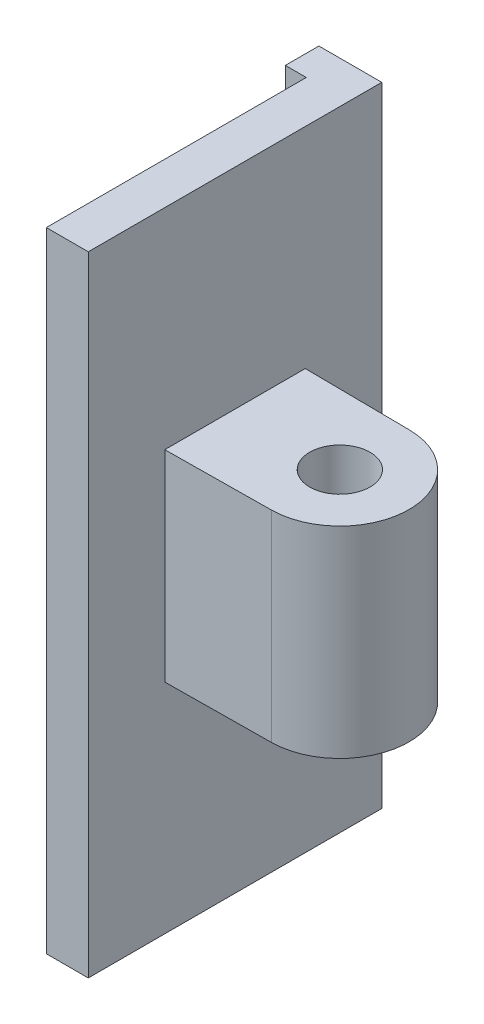
ISO-10303-21;
HEADER;
FILE_DESCRIPTION(('STEP AP214'),'2;1');
FILE_NAME('part.step','',(''),(''),'','','');
FILE_SCHEMA(('AUTOMOTIVE_DESIGN { 1 0 10303 214 1 1 1 1 }'));
ENDSEC;
DATA;
#1=APPLICATION_CONTEXT('core data for automotive mechanical design processes');
#2=APPLICATION_PROTOCOL_DEFINITION('international standard','automotive_design',2000,#1);
#3=PRODUCT_CONTEXT('',#1,'mechanical');
#4=PRODUCT('Part','Part','',(#3));
#5=PRODUCT_RELATED_PRODUCT_CATEGORY('part','',(#4));
#6=PRODUCT_DEFINITION_FORMATION('','',#4);
#7=PRODUCT_DEFINITION_CONTEXT('part definition',#1,'design');
#8=PRODUCT_DEFINITION('design','',#6,#7);
#9=PRODUCT_DEFINITION_SHAPE('','',#8);
#10=(LENGTH_UNIT() NAMED_UNIT(*) SI_UNIT(.MILLI.,.METRE.));
#11=(NAMED_UNIT(*) PLANE_ANGLE_UNIT() SI_UNIT($,.RADIAN.));
#12=(NAMED_UNIT(*) SI_UNIT($,.STERADIAN.) SOLID_ANGLE_UNIT());
#13=UNCERTAINTY_MEASURE_WITH_UNIT(LENGTH_MEASURE(1.E-05),#10,'distance_accuracy_value','');
#14=(GEOMETRIC_REPRESENTATION_CONTEXT(3) GLOBAL_UNCERTAINTY_ASSIGNED_CONTEXT((#13)) GLOBAL_UNIT_ASSIGNED_CONTEXT((#10,
#11,#12)) REPRESENTATION_CONTEXT('',''));
#15=CARTESIAN_POINT('',(0.,0.,0.));
#16=DIRECTION('',(0.,0.,1.));
#17=DIRECTION('',(1.,0.,0.));
#18=AXIS2_PLACEMENT_3D('',#15,#16,#17);
#19=CARTESIAN_POINT('',(0.750000000000001,-7.85,1.75));
#20=DIRECTION('',(1.,0.,0.));
#21=DIRECTION('',(0.,0.,-1.));
#22=AXIS2_PLACEMENT_3D('',#19,#20,#21);
#23=PLANE('',#22);
#24=DIRECTION('',(0.,1.,0.));
#25=VECTOR('',#24,1.);
#26=CARTESIAN_POINT('',(0.750000000000001,-5.35,-1.35));
#27=LINE('',#26,#25);
#28=CARTESIAN_POINT('',(0.750000000000001,-12.85,-1.35));
#29=VERTEX_POINT('',#28);
#30=CARTESIAN_POINT('',(0.750000000000001,-5.35,-1.35));
#31=VERTEX_POINT('',#30);
#32=EDGE_CURVE('E54',#29,#31,#27,.T.);
#33=ORIENTED_EDGE('',*,*,#32,.F.);
#34=DIRECTION('',(0.,0.,1.));
#35=VECTOR('',#34,1.);
#36=CARTESIAN_POINT('',(0.750000000000001,-12.85,-1.75));
#37=LINE('',#36,#35);
#38=CARTESIAN_POINT('',(0.750000000000001,-12.85,1.75));
#39=VERTEX_POINT('',#38);
#40=EDGE_CURVE('E165',#29,#39,#37,.T.);
#41=ORIENTED_EDGE('',*,*,#40,.T.);
#42=DIRECTION('',(0.,-1.,0.));
#43=VECTOR('',#42,1.);
#44=CARTESIAN_POINT('',(0.750000000000001,-7.85,1.75));
#45=LINE('',#44,#43);
#46=CARTESIAN_POINT('',(0.750000000000001,-5.35,1.75));
#47=VERTEX_POINT('',#46);
#48=EDGE_CURVE('E203',#47,#39,#45,.T.);
#49=ORIENTED_EDGE('',*,*,#48,.F.);
#50=DIRECTION('',(0.,0.,1.));
#51=VECTOR('',#50,1.);
#52=CARTESIAN_POINT('',(0.750000000000001,-5.35,-1.75));
#53=LINE('',#52,#51);
#54=EDGE_CURVE('E160',#31,#47,#53,.T.);
#55=ORIENTED_EDGE('',*,*,#54,.F.);
#56=EDGE_LOOP('',(#33,#41,#49,#55));
#57=FACE_BOUND('',#56,.T.);
#58=ADVANCED_FACE('F39',(#57),#23,.F.);
#59=CARTESIAN_POINT('',(2.5,-7.85,0.));
#60=DIRECTION('',(0.,1.,0.));
#61=DIRECTION('',(0.,0.,1.));
#62=AXIS2_PLACEMENT_3D('',#59,#60,#61);
#63=PLANE('',#62);
#64=DIRECTION('',(0.,0.,-1.));
#65=VECTOR('',#64,1.);
#66=CARTESIAN_POINT('',(1.25,-7.85,0.));
#67=LINE('',#66,#65);
#68=CARTESIAN_POINT('',(1.25,-7.85,0.837520556706433));
#69=VERTEX_POINT('',#68);
#70=CARTESIAN_POINT('',(1.25,-7.85,-0.837520556706434));
#71=VERTEX_POINT('',#70);
#72=EDGE_CURVE('E177',#69,#71,#67,.T.);
#73=ORIENTED_EDGE('',*,*,#72,.F.);
#74=DIRECTION('',(0.99995016804351,0.,-0.00998305713479181));
#75=VECTOR('',#74,1.);
#76=CARTESIAN_POINT('',(2.50823602213621,-7.85,0.824958888635898));
#77=LINE('',#76,#75);
#78=CARTESIAN_POINT('',(2.50823602213621,-7.85,0.824958888635898));
#79=VERTEX_POINT('',#78);
#80=EDGE_CURVE('E63',#69,#79,#77,.T.);
#81=ORIENTED_EDGE('',*,*,#80,.T.);
#82=CARTESIAN_POINT('',(2.5,-7.85,0.));
#83=DIRECTION('',(0.,1.,0.));
#84=DIRECTION('',(0.,0.,1.));
#85=AXIS2_PLACEMENT_3D('',#82,#83,#84);
#86=CIRCLE('',#85,0.825000000000001);
#87=CARTESIAN_POINT('',(2.50823602213621,-7.85,-0.824958888635896));
#88=VERTEX_POINT('',#87);
#89=EDGE_CURVE('E187',#79,#88,#86,.T.);
#90=ORIENTED_EDGE('',*,*,#89,.T.);
#91=DIRECTION('',(-0.99995016804351,0.,-0.00998305713479379));
#92=VECTOR('',#91,1.);
#93=CARTESIAN_POINT('',(1.25,-7.85,-0.837520556706434));
#94=LINE('',#93,#92);
#95=EDGE_CURVE('E85',#88,#71,#94,.T.);
#96=ORIENTED_EDGE('',*,*,#95,.T.);
#97=EDGE_LOOP('',(#73,#81,#90,#96));
#98=FACE_BOUND('',#97,.T.);
#99=CARTESIAN_POINT('',(2.5,-7.85,0.));
#100=DIRECTION('',(0.,1.,0.));
#101=DIRECTION('',(0.,0.,1.));
#102=AXIS2_PLACEMENT_3D('',#99,#100,#101);
#103=CIRCLE('',#102,0.36);
#104=CARTESIAN_POINT('',(2.5,-7.85,0.360000000000001));
#105=VERTEX_POINT('',#104);
#106=EDGE_CURVE('E181',#105,#105,#103,.T.);
#107=ORIENTED_EDGE('',*,*,#106,.F.);
#108=EDGE_LOOP('',(#107));
#109=FACE_BOUND('',#108,.T.);
#110=ADVANCED_FACE('F234',(#98,#109),#63,.T.);
#111=CARTESIAN_POINT('',(2.5,-10.25,0.));
#112=DIRECTION('',(0.,1.,0.));
#113=DIRECTION('',(0.,0.,1.));
#114=AXIS2_PLACEMENT_3D('',#111,#112,#113);
#115=PLANE('',#114);
#116=DIRECTION('',(0.99995016804351,0.,-0.00998305713479181));
#117=VECTOR('',#116,1.);
#118=CARTESIAN_POINT('',(2.50823602213621,-10.25,0.824958888635898));
#119=LINE('',#118,#117);
#120=CARTESIAN_POINT('',(1.25,-10.25,0.837520556706433));
#121=VERTEX_POINT('',#120);
#122=CARTESIAN_POINT('',(2.50823602213621,-10.25,0.824958888635898));
#123=VERTEX_POINT('',#122);
#124=EDGE_CURVE('E78',#121,#123,#119,.T.);
#125=ORIENTED_EDGE('',*,*,#124,.F.);
#126=DIRECTION('',(0.,0.,-1.));
#127=VECTOR('',#126,1.);
#128=CARTESIAN_POINT('',(1.25,-10.25,0.));
#129=LINE('',#128,#127);
#130=CARTESIAN_POINT('',(1.25,-10.25,-0.837520556706434));
#131=VERTEX_POINT('',#130);
#132=EDGE_CURVE('E175',#121,#131,#129,.T.);
#133=ORIENTED_EDGE('',*,*,#132,.T.);
#134=DIRECTION('',(-0.99995016804351,0.,-0.00998305713479379));
#135=VECTOR('',#134,1.);
#136=CARTESIAN_POINT('',(1.25,-10.25,-0.837520556706434));
#137=LINE('',#136,#135);
#138=CARTESIAN_POINT('',(2.50823602213621,-10.25,-0.824958888635896));
#139=VERTEX_POINT('',#138);
#140=EDGE_CURVE('E194',#139,#131,#137,.T.);
#141=ORIENTED_EDGE('',*,*,#140,.F.);
#142=CARTESIAN_POINT('',(2.5,-10.25,0.));
#143=DIRECTION('',(0.,1.,0.));
#144=DIRECTION('',(0.,0.,1.));
#145=AXIS2_PLACEMENT_3D('',#142,#143,#144);
#146=CIRCLE('',#145,0.825000000000001);
#147=EDGE_CURVE('E184',#123,#139,#146,.T.);
#148=ORIENTED_EDGE('',*,*,#147,.F.);
#149=EDGE_LOOP('',(#125,#133,#141,#148));
#150=FACE_BOUND('',#149,.T.);
#151=CARTESIAN_POINT('',(2.5,-10.25,0.));
#152=DIRECTION('',(0.,1.,0.));
#153=DIRECTION('',(0.,0.,1.));
#154=AXIS2_PLACEMENT_3D('',#151,#152,#153);
#155=CIRCLE('',#154,0.36);
#156=CARTESIAN_POINT('',(2.5,-10.25,0.360000000000001));
#157=VERTEX_POINT('',#156);
#158=EDGE_CURVE('E180',#157,#157,#155,.T.);
#159=ORIENTED_EDGE('',*,*,#158,.T.);
#160=EDGE_LOOP('',(#159));
#161=FACE_BOUND('',#160,.T.);
#162=ADVANCED_FACE('F215',(#150,#161),#115,.F.);
#163=CARTESIAN_POINT('',(2.5,-7.85,0.));
#164=DIRECTION('',(0.,-1.,0.));
#165=DIRECTION('',(0.,0.,-1.));
#166=AXIS2_PLACEMENT_3D('',#163,#164,#165);
#167=CYLINDRICAL_SURFACE('',#166,0.825000000000001);
#168=ORIENTED_EDGE('',*,*,#147,.T.);
#169=DIRECTION('',(0.,-1.,0.));
#170=VECTOR('',#169,1.);
#171=CARTESIAN_POINT('',(2.50823602213621,-7.85,-0.824958888635896));
#172=LINE('',#171,#170);
#173=EDGE_CURVE('E11',#88,#139,#172,.T.);
#174=ORIENTED_EDGE('',*,*,#173,.F.);
#175=ORIENTED_EDGE('',*,*,#89,.F.);
#176=DIRECTION('',(0.,-1.,0.));
#177=VECTOR('',#176,1.);
#178=CARTESIAN_POINT('',(2.50823602213621,-7.85,0.824958888635898));
#179=LINE('',#178,#177);
#180=EDGE_CURVE('E191',#79,#123,#179,.T.);
#181=ORIENTED_EDGE('',*,*,#180,.T.);
#182=EDGE_LOOP('',(#168,#174,#175,#181));
#183=FACE_BOUND('',#182,.T.);
#184=ADVANCED_FACE('F41',(#183),#167,.T.);
#185=CARTESIAN_POINT('',(1.25,-7.85,-0.837520556706434));
#186=DIRECTION('',(-0.00998305713479379,0.,0.99995016804351));
#187=DIRECTION('',(0.99995016804351,0.,0.00998305713479379));
#188=AXIS2_PLACEMENT_3D('',#185,#186,#187);
#189=PLANE('',#188);
#190=ORIENTED_EDGE('',*,*,#140,.T.);
#191=DIRECTION('',(0.,-1.,0.));
#192=VECTOR('',#191,1.);
#193=CARTESIAN_POINT('',(1.25,-7.85,-0.837520556706434));
#194=LINE('',#193,#192);
#195=EDGE_CURVE('E47',#71,#131,#194,.T.);
#196=ORIENTED_EDGE('',*,*,#195,.F.);
#197=ORIENTED_EDGE('',*,*,#95,.F.);
#198=ORIENTED_EDGE('',*,*,#173,.T.);
#199=EDGE_LOOP('',(#190,#196,#197,#198));
#200=FACE_BOUND('',#199,.T.);
#201=ADVANCED_FACE('F211',(#200),#189,.F.);
#202=CARTESIAN_POINT('',(0.750000000000001,-7.85,-1.75));
#203=DIRECTION('',(0.,0.,1.));
#204=DIRECTION('',(1.,0.,0.));
#205=AXIS2_PLACEMENT_3D('',#202,#203,#204);
#206=PLANE('',#205);
#207=DIRECTION('',(0.,-1.,0.));
#208=VECTOR('',#207,1.);
#209=CARTESIAN_POINT('',(1.25,-7.85,-1.75));
#210=LINE('',#209,#208);
#211=CARTESIAN_POINT('',(1.25,-5.35,-1.75));
#212=VERTEX_POINT('',#211);
#213=CARTESIAN_POINT('',(1.25,-12.85,-1.75));
#214=VERTEX_POINT('',#213);
#215=EDGE_CURVE('E131',#212,#214,#210,.T.);
#216=ORIENTED_EDGE('',*,*,#215,.T.);
#217=DIRECTION('',(-1.,0.,0.));
#218=VECTOR('',#217,1.);
#219=CARTESIAN_POINT('',(1.25,-12.85,-1.75));
#220=LINE('',#219,#218);
#221=CARTESIAN_POINT('',(0.500000000000001,-12.85,-1.75));
#222=VERTEX_POINT('',#221);
#223=EDGE_CURVE('E125',#214,#222,#220,.T.);
#224=ORIENTED_EDGE('',*,*,#223,.T.);
#225=DIRECTION('',(0.,-1.,0.));
#226=VECTOR('',#225,1.);
#227=CARTESIAN_POINT('',(0.500000000000001,-5.35,-1.75));
#228=LINE('',#227,#226);
#229=CARTESIAN_POINT('',(0.500000000000001,-5.35,-1.75));
#230=VERTEX_POINT('',#229);
#231=EDGE_CURVE('E130',#230,#222,#228,.T.);
#232=ORIENTED_EDGE('',*,*,#231,.F.);
#233=DIRECTION('',(-1.,0.,0.));
#234=VECTOR('',#233,1.);
#235=CARTESIAN_POINT('',(1.25,-5.35,-1.75));
#236=LINE('',#235,#234);
#237=EDGE_CURVE('E136',#212,#230,#236,.T.);
#238=ORIENTED_EDGE('',*,*,#237,.F.);
#239=EDGE_LOOP('',(#216,#224,#232,#238));
#240=FACE_BOUND('',#239,.T.);
#241=ADVANCED_FACE('F127',(#240),#206,.F.);
#242=CARTESIAN_POINT('',(1.25,-7.85,1.75));
#243=DIRECTION('',(0.,0.,-1.));
#244=DIRECTION('',(-1.,0.,0.));
#245=AXIS2_PLACEMENT_3D('',#242,#243,#244);
#246=PLANE('',#245);
#247=ORIENTED_EDGE('',*,*,#48,.T.);
#248=DIRECTION('',(-1.,0.,0.));
#249=VECTOR('',#248,1.);
#250=CARTESIAN_POINT('',(1.25,-12.85,1.75));
#251=LINE('',#250,#249);
#252=CARTESIAN_POINT('',(1.25,-12.85,1.75));
#253=VERTEX_POINT('',#252);
#254=EDGE_CURVE('E135',#253,#39,#251,.T.);
#255=ORIENTED_EDGE('',*,*,#254,.F.);
#256=DIRECTION('',(0.,-1.,0.));
#257=VECTOR('',#256,1.);
#258=CARTESIAN_POINT('',(1.25,-7.85,1.75));
#259=LINE('',#258,#257);
#260=CARTESIAN_POINT('',(1.25,-5.35,1.75));
#261=VERTEX_POINT('',#260);
#262=EDGE_CURVE('E201',#261,#253,#259,.T.);
#263=ORIENTED_EDGE('',*,*,#262,.F.);
#264=DIRECTION('',(-1.,0.,0.));
#265=VECTOR('',#264,1.);
#266=CARTESIAN_POINT('',(1.25,-5.35,1.75));
#267=LINE('',#266,#265);
#268=EDGE_CURVE('E172',#261,#47,#267,.T.);
#269=ORIENTED_EDGE('',*,*,#268,.T.);
#270=EDGE_LOOP('',(#247,#255,#263,#269));
#271=FACE_BOUND('',#270,.T.);
#272=ADVANCED_FACE('F230',(#271),#246,.F.);
#273=CARTESIAN_POINT('',(1.25,-7.85,0.837520556706433));
#274=DIRECTION('',(-1.,0.,0.));
#275=DIRECTION('',(0.,0.,1.));
#276=AXIS2_PLACEMENT_3D('',#273,#274,#275);
#277=PLANE('',#276);
#278=DIRECTION('',(0.,-1.,0.));
#279=VECTOR('',#278,1.);
#280=CARTESIAN_POINT('',(1.25,-7.85,0.837520556706433));
#281=LINE('',#280,#279);
#282=EDGE_CURVE('E199',#69,#121,#281,.T.);
#283=ORIENTED_EDGE('',*,*,#282,.F.);
#284=ORIENTED_EDGE('',*,*,#72,.T.);
#285=ORIENTED_EDGE('',*,*,#195,.T.);
#286=ORIENTED_EDGE('',*,*,#132,.F.);
#287=EDGE_LOOP('',(#283,#284,#285,#286));
#288=FACE_BOUND('',#287,.T.);
#289=ORIENTED_EDGE('',*,*,#262,.T.);
#290=DIRECTION('',(0.,0.,1.));
#291=VECTOR('',#290,1.);
#292=CARTESIAN_POINT('',(1.25,-12.85,-1.75));
#293=LINE('',#292,#291);
#294=EDGE_CURVE('E164',#214,#253,#293,.T.);
#295=ORIENTED_EDGE('',*,*,#294,.F.);
#296=ORIENTED_EDGE('',*,*,#215,.F.);
#297=DIRECTION('',(0.,0.,1.));
#298=VECTOR('',#297,1.);
#299=CARTESIAN_POINT('',(1.25,-5.35,-1.75));
#300=LINE('',#299,#298);
#301=EDGE_CURVE('E161',#212,#261,#300,.T.);
#302=ORIENTED_EDGE('',*,*,#301,.T.);
#303=EDGE_LOOP('',(#289,#295,#296,#302));
#304=FACE_BOUND('',#303,.T.);
#305=ADVANCED_FACE('F209',(#288,#304),#277,.F.);
#306=CARTESIAN_POINT('',(2.50823602213621,-7.85,0.824958888635898));
#307=DIRECTION('',(-0.00998305713479181,0.,-0.99995016804351));
#308=DIRECTION('',(-0.99995016804351,0.,0.00998305713479181));
#309=AXIS2_PLACEMENT_3D('',#306,#307,#308);
#310=PLANE('',#309);
#311=ORIENTED_EDGE('',*,*,#124,.T.);
#312=ORIENTED_EDGE('',*,*,#180,.F.);
#313=ORIENTED_EDGE('',*,*,#80,.F.);
#314=ORIENTED_EDGE('',*,*,#282,.T.);
#315=EDGE_LOOP('',(#311,#312,#313,#314));
#316=FACE_BOUND('',#315,.T.);
#317=ADVANCED_FACE('F219',(#316),#310,.F.);
#318=CARTESIAN_POINT('',(2.5,-7.85,0.));
#319=DIRECTION('',(0.,-1.,0.));
#320=DIRECTION('',(0.,0.,-1.));
#321=AXIS2_PLACEMENT_3D('',#318,#319,#320);
#322=CYLINDRICAL_SURFACE('',#321,0.36);
#323=ORIENTED_EDGE('',*,*,#106,.T.);
#324=EDGE_LOOP('',(#323));
#325=FACE_BOUND('',#324,.T.);
#326=ORIENTED_EDGE('',*,*,#158,.F.);
#327=EDGE_LOOP('',(#326));
#328=FACE_BOUND('',#327,.T.);
#329=ADVANCED_FACE('F221',(#325,#328),#322,.F.);
#330=CARTESIAN_POINT('',(1.25,-12.85,-1.75));
#331=DIRECTION('',(0.,-1.,0.));
#332=DIRECTION('',(1.,0.,0.));
#333=AXIS2_PLACEMENT_3D('',#330,#331,#332);
#334=PLANE('',#333);
#335=ORIENTED_EDGE('',*,*,#40,.F.);
#336=DIRECTION('',(1.,0.,0.));
#337=VECTOR('',#336,1.);
#338=CARTESIAN_POINT('',(0.500000000000001,-12.85,-1.35));
#339=LINE('',#338,#337);
#340=CARTESIAN_POINT('',(0.500000000000001,-12.85,-1.35));
#341=VERTEX_POINT('',#340);
#342=EDGE_CURVE('E142',#341,#29,#339,.T.);
#343=ORIENTED_EDGE('',*,*,#342,.F.);
#344=DIRECTION('',(0.,0.,1.));
#345=VECTOR('',#344,1.);
#346=CARTESIAN_POINT('',(0.500000000000001,-12.85,-1.75));
#347=LINE('',#346,#345);
#348=EDGE_CURVE('E139',#222,#341,#347,.T.);
#349=ORIENTED_EDGE('',*,*,#348,.F.);
#350=ORIENTED_EDGE('',*,*,#223,.F.);
#351=ORIENTED_EDGE('',*,*,#294,.T.);
#352=ORIENTED_EDGE('',*,*,#254,.T.);
#353=EDGE_LOOP('',(#335,#343,#349,#350,#351,#352));
#354=FACE_BOUND('',#353,.T.);
#355=ADVANCED_FACE('F140',(#354),#334,.T.);
#356=CARTESIAN_POINT('',(1.25,-5.35,-1.75));
#357=DIRECTION('',(0.,-1.,0.));
#358=DIRECTION('',(1.,0.,0.));
#359=AXIS2_PLACEMENT_3D('',#356,#357,#358);
#360=PLANE('',#359);
#361=ORIENTED_EDGE('',*,*,#237,.T.);
#362=DIRECTION('',(0.,0.,-1.));
#363=VECTOR('',#362,1.);
#364=CARTESIAN_POINT('',(0.500000000000001,-5.35,-1.75));
#365=LINE('',#364,#363);
#366=CARTESIAN_POINT('',(0.500000000000001,-5.35,-1.35));
#367=VERTEX_POINT('',#366);
#368=EDGE_CURVE('E150',#367,#230,#365,.T.);
#369=ORIENTED_EDGE('',*,*,#368,.F.);
#370=DIRECTION('',(1.,0.,0.));
#371=VECTOR('',#370,1.);
#372=CARTESIAN_POINT('',(0.500000000000001,-5.35,-1.35));
#373=LINE('',#372,#371);
#374=EDGE_CURVE('E155',#367,#31,#373,.T.);
#375=ORIENTED_EDGE('',*,*,#374,.T.);
#376=ORIENTED_EDGE('',*,*,#54,.T.);
#377=ORIENTED_EDGE('',*,*,#268,.F.);
#378=ORIENTED_EDGE('',*,*,#301,.F.);
#379=EDGE_LOOP('',(#361,#369,#375,#376,#377,#378));
#380=FACE_BOUND('',#379,.T.);
#381=ADVANCED_FACE('F258',(#380),#360,.F.);
#382=CARTESIAN_POINT('',(0.500000000000001,-5.35,-1.35));
#383=DIRECTION('',(0.,0.,-1.));
#384=DIRECTION('',(0.,1.,0.));
#385=AXIS2_PLACEMENT_3D('',#382,#383,#384);
#386=PLANE('',#385);
#387=ORIENTED_EDGE('',*,*,#32,.T.);
#388=ORIENTED_EDGE('',*,*,#374,.F.);
#389=DIRECTION('',(0.,1.,0.));
#390=VECTOR('',#389,1.);
#391=CARTESIAN_POINT('',(0.500000000000001,-5.35,-1.35));
#392=LINE('',#391,#390);
#393=EDGE_CURVE('E145',#341,#367,#392,.T.);
#394=ORIENTED_EDGE('',*,*,#393,.F.);
#395=ORIENTED_EDGE('',*,*,#342,.T.);
#396=EDGE_LOOP('',(#387,#388,#394,#395));
#397=FACE_BOUND('',#396,.T.);
#398=ADVANCED_FACE('F261',(#397),#386,.F.);
#399=CARTESIAN_POINT('',(0.500000000000001,0.,0.));
#400=DIRECTION('',(-1.,0.,0.));
#401=DIRECTION('',(0.,0.,1.));
#402=AXIS2_PLACEMENT_3D('',#399,#400,#401);
#403=PLANE('',#402);
#404=ORIENTED_EDGE('',*,*,#231,.T.);
#405=ORIENTED_EDGE('',*,*,#348,.T.);
#406=ORIENTED_EDGE('',*,*,#393,.T.);
#407=ORIENTED_EDGE('',*,*,#368,.T.);
#408=EDGE_LOOP('',(#404,#405,#406,#407));
#409=FACE_BOUND('',#408,.T.);
#410=ADVANCED_FACE('F148',(#409),#403,.T.);
#411=CLOSED_SHELL('',(#58,#110,#162,#184,#201,#241,#272,#305,#317,#329,#355,#381,#398,#410));
#412=MANIFOLD_SOLID_BREP('B2',#411);
#413=ADVANCED_BREP_SHAPE_REPRESENTATION('',(#18,#412),#14);
#414=SHAPE_DEFINITION_REPRESENTATION(#9,#413);
ENDSEC;
END-ISO-10303-21;
